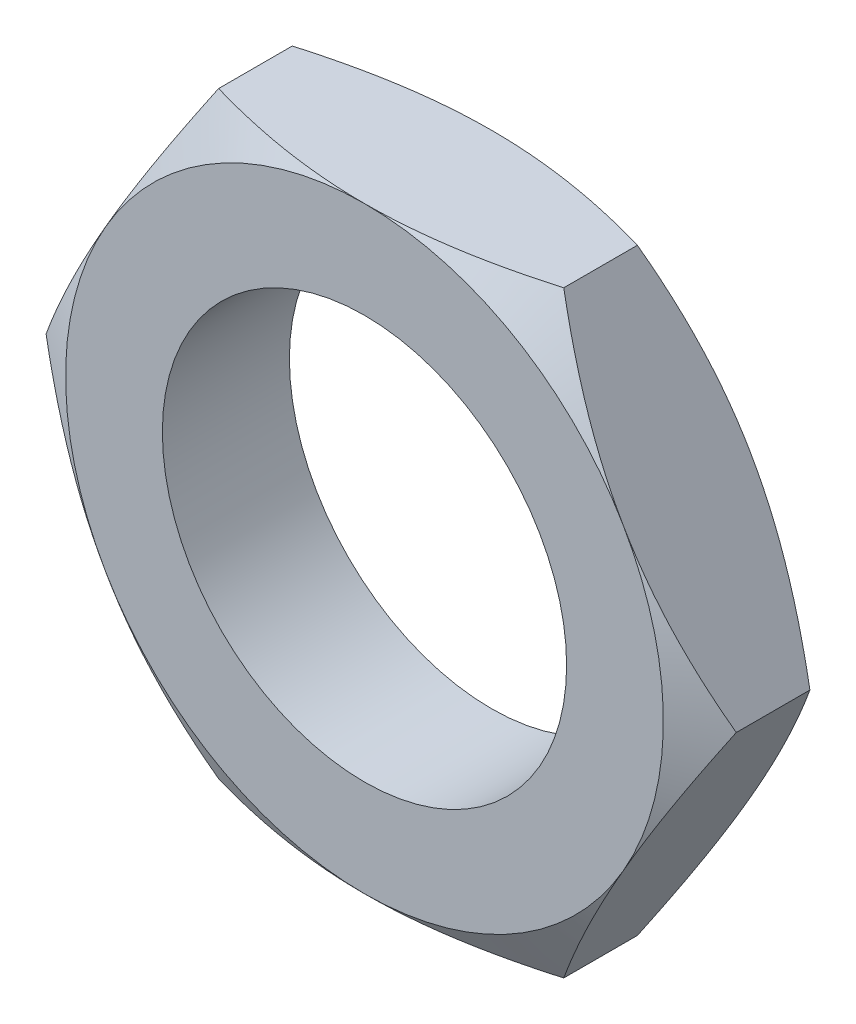
ISO-10303-21;
HEADER;
FILE_DESCRIPTION(('STEP AP214'),'2;1');
FILE_NAME('part.step','',(''),(''),'','','');
FILE_SCHEMA(('AUTOMOTIVE_DESIGN { 1 0 10303 214 1 1 1 1 }'));
ENDSEC;
DATA;
#1=APPLICATION_CONTEXT('core data for automotive mechanical design processes');
#2=APPLICATION_PROTOCOL_DEFINITION('international standard','automotive_design',2000,#1);
#3=PRODUCT_CONTEXT('',#1,'mechanical');
#4=PRODUCT('Part','Part','',(#3));
#5=PRODUCT_RELATED_PRODUCT_CATEGORY('part','',(#4));
#6=PRODUCT_DEFINITION_FORMATION('','',#4);
#7=PRODUCT_DEFINITION_CONTEXT('part definition',#1,'design');
#8=PRODUCT_DEFINITION('design','',#6,#7);
#9=PRODUCT_DEFINITION_SHAPE('','',#8);
#10=(LENGTH_UNIT() NAMED_UNIT(*) SI_UNIT(.MILLI.,.METRE.));
#11=(NAMED_UNIT(*) PLANE_ANGLE_UNIT() SI_UNIT($,.RADIAN.));
#12=(NAMED_UNIT(*) SI_UNIT($,.STERADIAN.) SOLID_ANGLE_UNIT());
#13=UNCERTAINTY_MEASURE_WITH_UNIT(LENGTH_MEASURE(1.E-05),#10,'distance_accuracy_value','');
#14=(GEOMETRIC_REPRESENTATION_CONTEXT(3) GLOBAL_UNCERTAINTY_ASSIGNED_CONTEXT((#13)) GLOBAL_UNIT_ASSIGNED_CONTEXT((#10,
#11,#12)) REPRESENTATION_CONTEXT('',''));
#15=CARTESIAN_POINT('',(0.,0.,0.));
#16=DIRECTION('',(0.,0.,1.));
#17=DIRECTION('',(1.,0.,0.));
#18=AXIS2_PLACEMENT_3D('',#15,#16,#17);
#19=CARTESIAN_POINT('',(-2.3094010767585,4.,0.85));
#20=DIRECTION('',(0.866025403784439,-0.5,0.));
#21=DIRECTION('',(0.5,0.866025403784439,0.));
#22=AXIS2_PLACEMENT_3D('',#19,#20,#21);
#23=PLANE('',#22);
#24=DIRECTION('',(0.,0.,-1.));
#25=VECTOR('',#24,1.);
#26=CARTESIAN_POINT('',(-2.3094010767585,4.,0.85));
#27=LINE('',#26,#25);
#28=CARTESIAN_POINT('',(-2.30940107675893,4.,0.492734410092085));
#29=VERTEX_POINT('',#28);
#30=CARTESIAN_POINT('',(-2.3094010767585,4.,-0.492734410091836));
#31=VERTEX_POINT('',#30);
#32=EDGE_CURVE('E264',#29,#31,#27,.T.);
#33=ORIENTED_EDGE('',*,*,#32,.T.);
#34=CARTESIAN_POINT('',(-2.30928560670467,4.0002,-0.492667740925232));
#35=CARTESIAN_POINT('',(-2.4107717464617,3.82442084967677,-0.551282126351716));
#36=CARTESIAN_POINT('',(-2.51313390883499,3.64712438367362,-0.604589678537736));
#37=CARTESIAN_POINT('',(-2.71963072479811,3.28946140682429,-0.697638329253595));
#38=CARTESIAN_POINT('',(-2.82376904741904,3.10908854102985,-0.737346510970295));
#39=CARTESIAN_POINT('',(-3.03075510011795,2.75057818129721,-0.79915778471972));
#40=CARTESIAN_POINT('',(-3.13357098372492,2.57249584706486,-0.82167226847711));
#41=CARTESIAN_POINT('',(-3.33968651028528,2.21549328283349,-0.848549376853417));
#42=CARTESIAN_POINT('',(-3.44298540411434,2.0365743503559,-0.852934258573055));
#43=CARTESIAN_POINT('',(-3.63600352522932,1.70225715780327,-0.843809927060029));
#44=CARTESIAN_POINT('',(-3.72575165335064,1.54680884001293,-0.832541046012005));
#45=CARTESIAN_POINT('',(-3.90466320392054,1.23692494436494,-0.796826009201806));
#46=CARTESIAN_POINT('',(-3.99382600759478,1.08249043825587,-0.772367654288466));
#47=CARTESIAN_POINT('',(-4.17310641015197,0.771967672225421,-0.71122393508071));
#48=CARTESIAN_POINT('',(-4.26320131938131,0.615918711936897,-0.674279396345136));
#49=CARTESIAN_POINT('',(-4.4420474282755,0.30614816459616,-0.590429927451973));
#50=CARTESIAN_POINT('',(-4.53080091904966,0.15242260922622,-0.54354469778726));
#51=CARTESIAN_POINT('',(-4.61891762357084,-0.000200000000000639,-0.492667740925233));
#52=B_SPLINE_CURVE_WITH_KNOTS('',3,(#34,#35,#36,#37,#38,#39,#40,#41,#42,#43,#44,#45,#46,#47,#48,
#49,#50,#51),.UNSPECIFIED.,.F.,.F.,(4,2,2,2,2,2,2,2,4),(0.,0.634047835695966,1.26961969224543,
1.88946157213122,2.50854226669297,3.04757825393386,3.58711366126903,4.13861653143764,
4.68903648037743),.UNSPECIFIED.);
#53=CARTESIAN_POINT('',(-3.46410161513775,2.,-0.85));
#54=VERTEX_POINT('',#53);
#55=EDGE_CURVE('E76',#31,#54,#52,.T.);
#56=ORIENTED_EDGE('',*,*,#55,.T.);
#57=CARTESIAN_POINT('',(-4.618802153517,0.,-0.492734410091837));
#58=VERTEX_POINT('',#57);
#59=EDGE_CURVE('E228',#54,#58,#52,.T.);
#60=ORIENTED_EDGE('',*,*,#59,.T.);
#61=DIRECTION('',(0.,0.,-1.));
#62=VECTOR('',#61,1.);
#63=CARTESIAN_POINT('',(-4.618802153517,0.,0.85));
#64=LINE('',#63,#62);
#65=CARTESIAN_POINT('',(-4.618802153517,0.,0.492734410091837));
#66=VERTEX_POINT('',#65);
#67=EDGE_CURVE('E276',#66,#58,#64,.T.);
#68=ORIENTED_EDGE('',*,*,#67,.F.);
#69=CARTESIAN_POINT('',(-2.30928560670467,4.0002,0.492667740925232));
#70=CARTESIAN_POINT('',(-2.4107717464617,3.82442084967677,0.551282126351716));
#71=CARTESIAN_POINT('',(-2.51313390883499,3.64712438367362,0.604589678537736));
#72=CARTESIAN_POINT('',(-2.71963072479811,3.28946140682429,0.697638329253595));
#73=CARTESIAN_POINT('',(-2.82376904741904,3.10908854102985,0.737346510970295));
#74=CARTESIAN_POINT('',(-3.03075510011795,2.75057818129721,0.79915778471972));
#75=CARTESIAN_POINT('',(-3.13357098372492,2.57249584706486,0.82167226847711));
#76=CARTESIAN_POINT('',(-3.33968651028528,2.21549328283349,0.848549376853417));
#77=CARTESIAN_POINT('',(-3.44298540411434,2.0365743503559,0.852934258573055));
#78=CARTESIAN_POINT('',(-3.63600352522932,1.70225715780327,0.843809927060029));
#79=CARTESIAN_POINT('',(-3.72575165335064,1.54680884001293,0.832541046012005));
#80=CARTESIAN_POINT('',(-3.90466320392054,1.23692494436494,0.796826009201806));
#81=CARTESIAN_POINT('',(-3.99382600759478,1.08249043825587,0.772367654288466));
#82=CARTESIAN_POINT('',(-4.17310641015197,0.771967672225421,0.71122393508071));
#83=CARTESIAN_POINT('',(-4.26320131938131,0.615918711936897,0.674279396345136));
#84=CARTESIAN_POINT('',(-4.4420474282755,0.30614816459616,0.590429927451973));
#85=CARTESIAN_POINT('',(-4.53080091904966,0.15242260922622,0.54354469778726));
#86=CARTESIAN_POINT('',(-4.61891762357084,-0.000200000000000639,0.492667740925233));
#87=B_SPLINE_CURVE_WITH_KNOTS('',3,(#69,#70,#71,#72,#73,#74,#75,#76,#77,#78,#79,#80,#81,#82,#83,
#84,#85,#86),.UNSPECIFIED.,.F.,.F.,(4,2,2,2,2,2,2,2,4),(0.,0.634047835695966,1.26961969224543,
1.88946157213122,2.50854226669297,3.04757825393386,3.58711366126903,4.13861653143764,
4.68903648037743),.UNSPECIFIED.);
#88=CARTESIAN_POINT('',(-3.46410161513775,2.,0.85));
#89=VERTEX_POINT('',#88);
#90=EDGE_CURVE('E257',#89,#66,#87,.T.);
#91=ORIENTED_EDGE('',*,*,#90,.F.);
#92=EDGE_CURVE('E263',#29,#89,#87,.T.);
#93=ORIENTED_EDGE('',*,*,#92,.F.);
#94=EDGE_LOOP('',(#33,#56,#60,#68,#91,#93));
#95=FACE_BOUND('',#94,.T.);
#96=ADVANCED_FACE('F54',(#95),#23,.F.);
#97=CARTESIAN_POINT('',(-4.618802153517,0.,0.85));
#98=DIRECTION('',(0.866025403784438,0.5,0.));
#99=DIRECTION('',(-0.5,0.866025403784439,0.));
#100=AXIS2_PLACEMENT_3D('',#97,#98,#99);
#101=PLANE('',#100);
#102=ORIENTED_EDGE('',*,*,#67,.T.);
#103=CARTESIAN_POINT('',(-4.61891762357084,0.00019999999999937,-0.492667740925233));
#104=CARTESIAN_POINT('',(-4.5174314838138,-0.175579150323229,-0.551282126351717));
#105=CARTESIAN_POINT('',(-4.41506932144051,-0.352875616326381,-0.604589678537737));
#106=CARTESIAN_POINT('',(-4.20857250547739,-0.710538593175707,-0.697638329253596));
#107=CARTESIAN_POINT('',(-4.10443418285646,-0.890911458970151,-0.737346510970295));
#108=CARTESIAN_POINT('',(-3.89744813015756,-1.24942181870279,-0.79915778471972));
#109=CARTESIAN_POINT('',(-3.79463224655059,-1.42750415293514,-0.82167226847711));
#110=CARTESIAN_POINT('',(-3.58851671999022,-1.78450671716651,-0.848549376853417));
#111=CARTESIAN_POINT('',(-3.48521782616117,-1.9634256496441,-0.852934258573056));
#112=CARTESIAN_POINT('',(-3.29219970504618,-2.29774284219673,-0.843809927060029));
#113=CARTESIAN_POINT('',(-3.20245157692486,-2.45319115998707,-0.832541046012005));
#114=CARTESIAN_POINT('',(-3.02354002635496,-2.76307505563506,-0.796826009201806));
#115=CARTESIAN_POINT('',(-2.93437722268072,-2.91750956174413,-0.772367654288466));
#116=CARTESIAN_POINT('',(-2.75509682012354,-3.22803232777458,-0.71122393508071));
#117=CARTESIAN_POINT('',(-2.66500191089419,-3.3840812880631,-0.674279396345136));
#118=CARTESIAN_POINT('',(-2.486155802,-3.69385183540384,-0.590429927451972));
#119=CARTESIAN_POINT('',(-2.39740231122584,-3.84757739077378,-0.543544697787259));
#120=CARTESIAN_POINT('',(-2.30928560670466,-4.0002,-0.492667740925232));
#121=B_SPLINE_CURVE_WITH_KNOTS('',3,(#103,#104,#105,#106,#107,#108,#109,#110,#111,#112,#113,
#114,#115,#116,#117,#118,#119,#120),.UNSPECIFIED.,.F.,.F.,(4,2,2,2,2,2,2,2,4),(0.,
0.634047835695966,1.26961969224543,1.88946157213122,2.50854226669297,3.04757825393386,
3.58711366126903,4.13861653143764,4.68903648037743),.UNSPECIFIED.);
#122=CARTESIAN_POINT('',(-3.46410161513775,-2.,-0.85));
#123=VERTEX_POINT('',#122);
#124=EDGE_CURVE('E226',#58,#123,#121,.T.);
#125=ORIENTED_EDGE('',*,*,#124,.T.);
#126=CARTESIAN_POINT('',(-2.30940107675882,-4.,-0.492734410092026));
#127=VERTEX_POINT('',#126);
#128=EDGE_CURVE('E220',#123,#127,#121,.T.);
#129=ORIENTED_EDGE('',*,*,#128,.T.);
#130=DIRECTION('',(0.,0.,-1.));
#131=VECTOR('',#130,1.);
#132=CARTESIAN_POINT('',(-2.3094010767585,-4.,0.85));
#133=LINE('',#132,#131);
#134=CARTESIAN_POINT('',(-2.30940107675882,-4.,0.492734410092026));
#135=VERTEX_POINT('',#134);
#136=EDGE_CURVE('E273',#135,#127,#133,.T.);
#137=ORIENTED_EDGE('',*,*,#136,.F.);
#138=CARTESIAN_POINT('',(-4.61891762357084,0.00019999999999937,0.492667740925233));
#139=CARTESIAN_POINT('',(-4.5174314838138,-0.175579150323229,0.551282126351717));
#140=CARTESIAN_POINT('',(-4.41506932144051,-0.352875616326381,0.604589678537737));
#141=CARTESIAN_POINT('',(-4.20857250547739,-0.710538593175707,0.697638329253596));
#142=CARTESIAN_POINT('',(-4.10443418285646,-0.890911458970151,0.737346510970295));
#143=CARTESIAN_POINT('',(-3.89744813015756,-1.24942181870279,0.79915778471972));
#144=CARTESIAN_POINT('',(-3.79463224655059,-1.42750415293514,0.82167226847711));
#145=CARTESIAN_POINT('',(-3.58851671999022,-1.78450671716651,0.848549376853417));
#146=CARTESIAN_POINT('',(-3.48521782616117,-1.9634256496441,0.852934258573056));
#147=CARTESIAN_POINT('',(-3.29219970504618,-2.29774284219673,0.843809927060029));
#148=CARTESIAN_POINT('',(-3.20245157692486,-2.45319115998707,0.832541046012005));
#149=CARTESIAN_POINT('',(-3.02354002635496,-2.76307505563506,0.796826009201806));
#150=CARTESIAN_POINT('',(-2.93437722268072,-2.91750956174413,0.772367654288466));
#151=CARTESIAN_POINT('',(-2.75509682012354,-3.22803232777458,0.71122393508071));
#152=CARTESIAN_POINT('',(-2.66500191089419,-3.3840812880631,0.674279396345136));
#153=CARTESIAN_POINT('',(-2.486155802,-3.69385183540384,0.590429927451972));
#154=CARTESIAN_POINT('',(-2.39740231122584,-3.84757739077378,0.543544697787259));
#155=CARTESIAN_POINT('',(-2.30928560670466,-4.0002,0.492667740925232));
#156=B_SPLINE_CURVE_WITH_KNOTS('',3,(#138,#139,#140,#141,#142,#143,#144,#145,#146,#147,#148,
#149,#150,#151,#152,#153,#154,#155),.UNSPECIFIED.,.F.,.F.,(4,2,2,2,2,2,2,2,4),(0.,
0.634047835695966,1.26961969224543,1.88946157213122,2.50854226669297,3.04757825393386,
3.58711366126903,4.13861653143764,4.68903648037743),.UNSPECIFIED.);
#157=CARTESIAN_POINT('',(-3.46410161513775,-2.,0.85));
#158=VERTEX_POINT('',#157);
#159=EDGE_CURVE('E242',#158,#135,#156,.T.);
#160=ORIENTED_EDGE('',*,*,#159,.F.);
#161=EDGE_CURVE('E249',#66,#158,#156,.T.);
#162=ORIENTED_EDGE('',*,*,#161,.F.);
#163=EDGE_LOOP('',(#102,#125,#129,#137,#160,#162));
#164=FACE_BOUND('',#163,.T.);
#165=ADVANCED_FACE('F234',(#164),#101,.F.);
#166=CARTESIAN_POINT('',(-2.3094010767585,-4.,0.85));
#167=DIRECTION('',(0.,1.,0.));
#168=DIRECTION('',(-1.,0.,0.));
#169=AXIS2_PLACEMENT_3D('',#166,#167,#168);
#170=PLANE('',#169);
#171=ORIENTED_EDGE('',*,*,#136,.T.);
#172=CARTESIAN_POINT('',(-7.0354167030111,-4.,1.51311031737804));
#173=CARTESIAN_POINT('',(-6.86760372971957,-4.,1.42889772977423));
#174=CARTESIAN_POINT('',(-6.69950328318655,-4.,1.34525210262091));
#175=CARTESIAN_POINT('',(-6.36259576329523,-4.,1.1793695055301));
#176=CARTESIAN_POINT('',(-6.19378864497809,-4.,1.09713262696631));
#177=CARTESIAN_POINT('',(-5.85502434693904,-4.,0.934192854390302));
#178=CARTESIAN_POINT('',(-5.68506555655915,-4.,0.853493302095932));
#179=CARTESIAN_POINT('',(-5.34417657551742,-4.,0.694177324649562));
#180=CARTESIAN_POINT('',(-5.17324640351946,-4.,0.615560859636856));
#181=CARTESIAN_POINT('',(-4.82235493385197,-4.,0.457344528023954));
#182=CARTESIAN_POINT('',(-4.64233915836721,-4.,0.377865090957746));
#183=CARTESIAN_POINT('',(-4.28078904780677,-4.,0.222441970435232));
#184=CARTESIAN_POINT('',(-4.09925476448125,-4.,0.14649816706035));
#185=CARTESIAN_POINT('',(-3.73446517433517,-4.,-0.000854789086803862));
#186=CARTESIAN_POINT('',(-3.55121091338518,-4.,-0.072266515558576));
#187=CARTESIAN_POINT('',(-3.18256813565656,-4.,-0.209323801432343));
#188=CARTESIAN_POINT('',(-2.99717985279721,-4.,-0.274969986139144));
#189=CARTESIAN_POINT('',(-2.58163745287054,-4.,-0.412906272232169));
#190=CARTESIAN_POINT('',(-2.35085554020753,-4.,-0.483332935105294));
#191=CARTESIAN_POINT('',(-1.88511085576049,-4.,-0.609144464884783));
#192=CARTESIAN_POINT('',(-1.6501483787916,-4.,-0.664530388025829));
#193=CARTESIAN_POINT('',(-1.29690070623206,-4.,-0.732475974569591));
#194=CARTESIAN_POINT('',(-1.18003772774412,-4.,-0.752491766949099));
#195=CARTESIAN_POINT('',(-0.945537516329266,-4.,-0.787256431534388));
#196=CARTESIAN_POINT('',(-0.827900398276434,-4.,-0.80200606800022));
#197=CARTESIAN_POINT('',(-0.592082435668501,-4.,-0.825799345702007));
#198=CARTESIAN_POINT('',(-0.473901769485933,-4.,-0.834844740629782));
#199=CARTESIAN_POINT('',(-0.237231351511309,-4.,-0.846942916621338));
#200=CARTESIAN_POINT('',(-0.118741601367087,-4.,-0.849995729568525));
#201=CARTESIAN_POINT('',(0.119039549355623,-4.,-0.850004290137372));
#202=CARTESIAN_POINT('',(0.238330953445572,-4.,-0.846918674819495));
#203=CARTESIAN_POINT('',(0.476598553826428,-4.,-0.834674397064765));
#204=CARTESIAN_POINT('',(0.595574748727477,-4.,-0.825515707894364));
#205=CARTESIAN_POINT('',(0.832974734060533,-4.,-0.801422792664298));
#206=CARTESIAN_POINT('',(0.951398334766151,-4.,-0.786486712269391));
#207=CARTESIAN_POINT('',(1.18745780226662,-4.,-0.751286766300194));
#208=CARTESIAN_POINT('',(1.30509355039818,-4.,-0.731022115874979));
#209=CARTESIAN_POINT('',(1.66061817953805,-4.,-0.662253816619181));
#210=CARTESIAN_POINT('',(1.89706203836294,-4.,-0.606218871176658));
#211=CARTESIAN_POINT('',(2.3658378938922,-4.,-0.478963895761078));
#212=CARTESIAN_POINT('',(2.59816739318186,-4.,-0.407734963596663));
#213=CARTESIAN_POINT('',(3.01441850757065,-4.,-0.268970558638927));
#214=CARTESIAN_POINT('',(3.19900196405254,-4.,-0.203390906077278));
#215=CARTESIAN_POINT('',(3.56599056687101,-4.,-0.0665787444425987));
#216=CARTESIAN_POINT('',(3.7483963070025,-4.,0.00465218124216086));
#217=CARTESIAN_POINT('',(4.11154199823315,-4.,0.151590843250665));
#218=CARTESIAN_POINT('',(4.29228061672961,-4.,0.227301853483712));
#219=CARTESIAN_POINT('',(4.65225738549896,-4.,0.382213731889331));
#220=CARTESIAN_POINT('',(4.83149548590287,-4.,0.461414715505863));
#221=CARTESIAN_POINT('',(5.18089735939133,-4.,0.619062057539629));
#222=CARTESIAN_POINT('',(5.35111488257247,-4.,0.697389668173014));
#223=CARTESIAN_POINT('',(5.69058260216348,-4.,0.856103128401234));
#224=CARTESIAN_POINT('',(5.85983281371757,-4.,0.936488945664216));
#225=CARTESIAN_POINT('',(6.19719884389014,-4.,1.09878998799408));
#226=CARTESIAN_POINT('',(6.36531621133107,-4.,1.18070200024097));
#227=CARTESIAN_POINT('',(6.7008563504105,-4.,1.34592527628057));
#228=CARTESIAN_POINT('',(6.86827914209004,-4.,1.42923649934582));
#229=CARTESIAN_POINT('',(7.03541670301111,-4.,1.51311031737804));
#230=B_SPLINE_CURVE_WITH_KNOTS('',3,(#172,#173,#174,#175,#176,#177,#178,#179,#180,#181,#182,
#183,#184,#185,#186,#187,#188,#189,#190,#191,#192,#193,#194,#195,#196,#197,#198,#199,#200,#201,
#202,#203,#204,#205,#206,#207,#208,#209,#210,#211,#212,#213,#214,#215,#216,#217,#218,#219,#220,
#221,#222,#223,#224,#225,#226,#227,#228,#229),.UNSPECIFIED.,.F.,.F.,(4,2,2,2,2,2,2,2,2,2,2,2,2,
2,2,2,2,2,2,2,2,2,2,2,2,2,2,2,4),(0.,0.563275966024877,1.12658832975423,1.69101060535138,
2.25542207269203,2.84573438591308,3.43602666282177,4.02598066519246,4.61587060458144,
5.33938309647816,6.06284476662439,6.41843896725476,6.77398154066042,7.12941475395937,
7.48484607617825,7.84268053519258,8.20051656939736,8.5584675515567,8.91647128627039,
9.64469684526638,10.3733502509875,10.9609014277994,11.5482885604647,12.1361103697513,
12.723951638067,13.2860589593527,13.8481574560461,14.409182835701,14.9701919135405),.UNSPECIFIED.);
#231=CARTESIAN_POINT('',(0.,-4.,-0.85));
#232=VERTEX_POINT('',#231);
#233=EDGE_CURVE('E227',#127,#232,#230,.T.);
#234=ORIENTED_EDGE('',*,*,#233,.T.);
#235=CARTESIAN_POINT('',(2.3094010767585,-4.,-0.492734410091836));
#236=VERTEX_POINT('',#235);
#237=EDGE_CURVE('E213',#232,#236,#230,.T.);
#238=ORIENTED_EDGE('',*,*,#237,.T.);
#239=DIRECTION('',(0.,0.,-1.));
#240=VECTOR('',#239,1.);
#241=CARTESIAN_POINT('',(2.3094010767585,-4.,0.85));
#242=LINE('',#241,#240);
#243=CARTESIAN_POINT('',(2.3094010767585,-4.,0.492734410091836));
#244=VERTEX_POINT('',#243);
#245=EDGE_CURVE('E270',#244,#236,#242,.T.);
#246=ORIENTED_EDGE('',*,*,#245,.F.);
#247=CARTESIAN_POINT('',(-7.0354167030111,-4.,-1.51311031737804));
#248=CARTESIAN_POINT('',(-6.86760372971957,-4.,-1.42889772977423));
#249=CARTESIAN_POINT('',(-6.69950328318655,-4.,-1.34525210262091));
#250=CARTESIAN_POINT('',(-6.36259576329523,-4.,-1.1793695055301));
#251=CARTESIAN_POINT('',(-6.19378864497809,-4.,-1.09713262696631));
#252=CARTESIAN_POINT('',(-5.85502434693904,-4.,-0.934192854390302));
#253=CARTESIAN_POINT('',(-5.68506555655915,-4.,-0.853493302095932));
#254=CARTESIAN_POINT('',(-5.34417657551742,-4.,-0.694177324649562));
#255=CARTESIAN_POINT('',(-5.17324640351946,-4.,-0.615560859636856));
#256=CARTESIAN_POINT('',(-4.82235493385197,-4.,-0.457344528023954));
#257=CARTESIAN_POINT('',(-4.64233915836721,-4.,-0.377865090957746));
#258=CARTESIAN_POINT('',(-4.28078904780677,-4.,-0.222441970435232));
#259=CARTESIAN_POINT('',(-4.09925476448125,-4.,-0.14649816706035));
#260=CARTESIAN_POINT('',(-3.73446517433517,-4.,0.000854789086803862));
#261=CARTESIAN_POINT('',(-3.55121091338518,-4.,0.072266515558576));
#262=CARTESIAN_POINT('',(-3.18256813565656,-4.,0.209323801432343));
#263=CARTESIAN_POINT('',(-2.99717985279721,-4.,0.274969986139144));
#264=CARTESIAN_POINT('',(-2.58163745287054,-4.,0.412906272232169));
#265=CARTESIAN_POINT('',(-2.35085554020753,-4.,0.483332935105294));
#266=CARTESIAN_POINT('',(-1.88511085576049,-4.,0.609144464884783));
#267=CARTESIAN_POINT('',(-1.6501483787916,-4.,0.664530388025829));
#268=CARTESIAN_POINT('',(-1.29690070623206,-4.,0.732475974569591));
#269=CARTESIAN_POINT('',(-1.18003772774412,-4.,0.752491766949099));
#270=CARTESIAN_POINT('',(-0.945537516329266,-4.,0.787256431534388));
#271=CARTESIAN_POINT('',(-0.827900398276434,-4.,0.80200606800022));
#272=CARTESIAN_POINT('',(-0.592082435668501,-4.,0.825799345702007));
#273=CARTESIAN_POINT('',(-0.473901769485933,-4.,0.834844740629782));
#274=CARTESIAN_POINT('',(-0.237231351511309,-4.,0.846942916621338));
#275=CARTESIAN_POINT('',(-0.118741601367087,-4.,0.849995729568525));
#276=CARTESIAN_POINT('',(0.119039549355623,-4.,0.850004290137372));
#277=CARTESIAN_POINT('',(0.238330953445572,-4.,0.846918674819495));
#278=CARTESIAN_POINT('',(0.476598553826428,-4.,0.834674397064765));
#279=CARTESIAN_POINT('',(0.595574748727477,-4.,0.825515707894364));
#280=CARTESIAN_POINT('',(0.832974734060533,-4.,0.801422792664298));
#281=CARTESIAN_POINT('',(0.951398334766151,-4.,0.786486712269391));
#282=CARTESIAN_POINT('',(1.18745780226662,-4.,0.751286766300194));
#283=CARTESIAN_POINT('',(1.30509355039818,-4.,0.731022115874979));
#284=CARTESIAN_POINT('',(1.66061817953805,-4.,0.662253816619181));
#285=CARTESIAN_POINT('',(1.89706203836294,-4.,0.606218871176658));
#286=CARTESIAN_POINT('',(2.3658378938922,-4.,0.478963895761078));
#287=CARTESIAN_POINT('',(2.59816739318186,-4.,0.407734963596663));
#288=CARTESIAN_POINT('',(3.01441850757065,-4.,0.268970558638927));
#289=CARTESIAN_POINT('',(3.19900196405254,-4.,0.203390906077278));
#290=CARTESIAN_POINT('',(3.56599056687101,-4.,0.0665787444425987));
#291=CARTESIAN_POINT('',(3.7483963070025,-4.,-0.00465218124216086));
#292=CARTESIAN_POINT('',(4.11154199823315,-4.,-0.151590843250665));
#293=CARTESIAN_POINT('',(4.29228061672961,-4.,-0.227301853483712));
#294=CARTESIAN_POINT('',(4.65225738549896,-4.,-0.382213731889331));
#295=CARTESIAN_POINT('',(4.83149548590287,-4.,-0.461414715505863));
#296=CARTESIAN_POINT('',(5.18089735939133,-4.,-0.619062057539629));
#297=CARTESIAN_POINT('',(5.35111488257247,-4.,-0.697389668173014));
#298=CARTESIAN_POINT('',(5.69058260216348,-4.,-0.856103128401234));
#299=CARTESIAN_POINT('',(5.85983281371757,-4.,-0.936488945664216));
#300=CARTESIAN_POINT('',(6.19719884389014,-4.,-1.09878998799408));
#301=CARTESIAN_POINT('',(6.36531621133107,-4.,-1.18070200024097));
#302=CARTESIAN_POINT('',(6.7008563504105,-4.,-1.34592527628057));
#303=CARTESIAN_POINT('',(6.86827914209004,-4.,-1.42923649934582));
#304=CARTESIAN_POINT('',(7.03541670301111,-4.,-1.51311031737804));
#305=B_SPLINE_CURVE_WITH_KNOTS('',3,(#247,#248,#249,#250,#251,#252,#253,#254,#255,#256,#257,
#258,#259,#260,#261,#262,#263,#264,#265,#266,#267,#268,#269,#270,#271,#272,#273,#274,#275,#276,
#277,#278,#279,#280,#281,#282,#283,#284,#285,#286,#287,#288,#289,#290,#291,#292,#293,#294,#295,
#296,#297,#298,#299,#300,#301,#302,#303,#304),.UNSPECIFIED.,.F.,.F.,(4,2,2,2,2,2,2,2,2,2,2,2,2,
2,2,2,2,2,2,2,2,2,2,2,2,2,2,2,4),(0.,0.563275966024877,1.12658832975423,1.69101060535138,
2.25542207269203,2.84573438591308,3.43602666282177,4.02598066519246,4.61587060458144,
5.33938309647816,6.06284476662439,6.41843896725476,6.77398154066042,7.12941475395937,
7.48484607617825,7.84268053519258,8.20051656939736,8.5584675515567,8.91647128627039,
9.64469684526638,10.3733502509875,10.9609014277994,11.5482885604647,12.1361103697513,
12.723951638067,13.2860589593527,13.8481574560461,14.409182835701,14.9701919135405),.UNSPECIFIED.);
#306=CARTESIAN_POINT('',(0.,-4.,0.85));
#307=VERTEX_POINT('',#306);
#308=EDGE_CURVE('E251',#307,#244,#305,.T.);
#309=ORIENTED_EDGE('',*,*,#308,.F.);
#310=EDGE_CURVE('E250',#135,#307,#305,.T.);
#311=ORIENTED_EDGE('',*,*,#310,.F.);
#312=EDGE_LOOP('',(#171,#234,#238,#246,#309,#311));
#313=FACE_BOUND('',#312,.T.);
#314=ADVANCED_FACE('F237',(#313),#170,.F.);
#315=CARTESIAN_POINT('',(2.3094010767585,-4.,0.85));
#316=DIRECTION('',(-0.866025403784439,0.5,0.));
#317=DIRECTION('',(-0.5,-0.866025403784439,0.));
#318=AXIS2_PLACEMENT_3D('',#315,#316,#317);
#319=PLANE('',#318);
#320=ORIENTED_EDGE('',*,*,#245,.T.);
#321=CARTESIAN_POINT('',(2.30928560670467,-4.0002,-0.492667740925231));
#322=CARTESIAN_POINT('',(2.41077174646171,-3.82442084967677,-0.551282126351716));
#323=CARTESIAN_POINT('',(2.513133908835,-3.64712438367362,-0.604589678537735));
#324=CARTESIAN_POINT('',(2.71963072479812,-3.28946140682429,-0.697638329253595));
#325=CARTESIAN_POINT('',(2.82376904741904,-3.10908854102985,-0.737346510970294));
#326=CARTESIAN_POINT('',(3.03075510011795,-2.75057818129721,-0.799157784719719));
#327=CARTESIAN_POINT('',(3.13357098372492,-2.57249584706486,-0.821672268477109));
#328=CARTESIAN_POINT('',(3.33968651028528,-2.21549328283349,-0.848549376853416));
#329=CARTESIAN_POINT('',(3.44298540411434,-2.0365743503559,-0.852934258573055));
#330=CARTESIAN_POINT('',(3.63600352522932,-1.70225715780327,-0.843809927060028));
#331=CARTESIAN_POINT('',(3.72575165335065,-1.54680884001293,-0.832541046012004));
#332=CARTESIAN_POINT('',(3.90466320392054,-1.23692494436494,-0.796826009201805));
#333=CARTESIAN_POINT('',(3.99382600759478,-1.08249043825587,-0.772367654288465));
#334=CARTESIAN_POINT('',(4.17310641015197,-0.771967672225421,-0.711223935080709));
#335=CARTESIAN_POINT('',(4.26320131938131,-0.615918711936896,-0.674279396345135));
#336=CARTESIAN_POINT('',(4.4420474282755,-0.306148164596159,-0.590429927451971));
#337=CARTESIAN_POINT('',(4.53080091904966,-0.152422609226219,-0.543544697787258));
#338=CARTESIAN_POINT('',(4.61891762357084,0.000200000000001888,-0.492667740925232));
#339=B_SPLINE_CURVE_WITH_KNOTS('',3,(#321,#322,#323,#324,#325,#326,#327,#328,#329,#330,#331,
#332,#333,#334,#335,#336,#337,#338),.UNSPECIFIED.,.F.,.F.,(4,2,2,2,2,2,2,2,4),(0.,
0.634047835695966,1.26961969224543,1.88946157213122,2.50854226669297,3.04757825393386,
3.58711366126903,4.13861653143764,4.68903648037743),.UNSPECIFIED.);
#340=CARTESIAN_POINT('',(3.46410161513775,-2.,-0.85));
#341=VERTEX_POINT('',#340);
#342=EDGE_CURVE('E176',#236,#341,#339,.T.);
#343=ORIENTED_EDGE('',*,*,#342,.T.);
#344=CARTESIAN_POINT('',(4.61880215351701,0.,-0.492734410091836));
#345=VERTEX_POINT('',#344);
#346=EDGE_CURVE('E161',#341,#345,#339,.T.);
#347=ORIENTED_EDGE('',*,*,#346,.T.);
#348=DIRECTION('',(0.,0.,-1.));
#349=VECTOR('',#348,1.);
#350=CARTESIAN_POINT('',(4.61880215351701,0.,0.85));
#351=LINE('',#350,#349);
#352=CARTESIAN_POINT('',(4.61880215351701,0.,0.492734410091836));
#353=VERTEX_POINT('',#352);
#354=EDGE_CURVE('E175',#353,#345,#351,.T.);
#355=ORIENTED_EDGE('',*,*,#354,.F.);
#356=CARTESIAN_POINT('',(2.30928560670467,-4.0002,0.492667740925231));
#357=CARTESIAN_POINT('',(2.41077174646171,-3.82442084967677,0.551282126351716));
#358=CARTESIAN_POINT('',(2.513133908835,-3.64712438367362,0.604589678537735));
#359=CARTESIAN_POINT('',(2.71963072479812,-3.28946140682429,0.697638329253595));
#360=CARTESIAN_POINT('',(2.82376904741904,-3.10908854102985,0.737346510970294));
#361=CARTESIAN_POINT('',(3.03075510011795,-2.75057818129721,0.799157784719719));
#362=CARTESIAN_POINT('',(3.13357098372492,-2.57249584706486,0.821672268477109));
#363=CARTESIAN_POINT('',(3.33968651028528,-2.21549328283349,0.848549376853416));
#364=CARTESIAN_POINT('',(3.44298540411434,-2.0365743503559,0.852934258573055));
#365=CARTESIAN_POINT('',(3.63600352522932,-1.70225715780327,0.843809927060028));
#366=CARTESIAN_POINT('',(3.72575165335065,-1.54680884001293,0.832541046012004));
#367=CARTESIAN_POINT('',(3.90466320392054,-1.23692494436494,0.796826009201805));
#368=CARTESIAN_POINT('',(3.99382600759478,-1.08249043825587,0.772367654288465));
#369=CARTESIAN_POINT('',(4.17310641015197,-0.771967672225421,0.711223935080709));
#370=CARTESIAN_POINT('',(4.26320131938131,-0.615918711936896,0.674279396345135));
#371=CARTESIAN_POINT('',(4.4420474282755,-0.306148164596159,0.590429927451971));
#372=CARTESIAN_POINT('',(4.53080091904966,-0.152422609226219,0.543544697787258));
#373=CARTESIAN_POINT('',(4.61891762357084,0.000200000000001888,0.492667740925232));
#374=B_SPLINE_CURVE_WITH_KNOTS('',3,(#356,#357,#358,#359,#360,#361,#362,#363,#364,#365,#366,
#367,#368,#369,#370,#371,#372,#373),.UNSPECIFIED.,.F.,.F.,(4,2,2,2,2,2,2,2,4),(0.,
0.634047835695966,1.26961969224543,1.88946157213122,2.50854226669297,3.04757825393386,
3.58711366126903,4.13861653143764,4.68903648037743),.UNSPECIFIED.);
#375=CARTESIAN_POINT('',(3.46410161513775,-2.,0.85));
#376=VERTEX_POINT('',#375);
#377=EDGE_CURVE('E308',#376,#353,#374,.T.);
#378=ORIENTED_EDGE('',*,*,#377,.F.);
#379=EDGE_CURVE('E307',#244,#376,#374,.T.);
#380=ORIENTED_EDGE('',*,*,#379,.F.);
#381=EDGE_LOOP('',(#320,#343,#347,#355,#378,#380));
#382=FACE_BOUND('',#381,.T.);
#383=ADVANCED_FACE('F321',(#382),#319,.F.);
#384=CARTESIAN_POINT('',(4.61880215351701,0.,0.85));
#385=DIRECTION('',(-0.866025403784438,-0.5,0.));
#386=DIRECTION('',(0.5,-0.866025403784438,0.));
#387=AXIS2_PLACEMENT_3D('',#384,#385,#386);
#388=PLANE('',#387);
#389=ORIENTED_EDGE('',*,*,#354,.T.);
#390=CARTESIAN_POINT('',(4.61891762357084,-0.000199999999998687,-0.492667740925231));
#391=CARTESIAN_POINT('',(4.5174314838138,0.175579150323229,-0.551282126351716));
#392=CARTESIAN_POINT('',(4.41506932144052,0.352875616326382,-0.604589678537735));
#393=CARTESIAN_POINT('',(4.20857250547739,0.710538593175708,-0.697638329253594));
#394=CARTESIAN_POINT('',(4.10443418285647,0.890911458970152,-0.737346510970294));
#395=CARTESIAN_POINT('',(3.89744813015756,1.24942181870279,-0.799157784719719));
#396=CARTESIAN_POINT('',(3.79463224655059,1.42750415293514,-0.821672268477109));
#397=CARTESIAN_POINT('',(3.58851671999023,1.78450671716651,-0.848549376853416));
#398=CARTESIAN_POINT('',(3.48521782616117,1.9634256496441,-0.852934258573054));
#399=CARTESIAN_POINT('',(3.29219970504619,2.29774284219673,-0.843809927060028));
#400=CARTESIAN_POINT('',(3.20245157692486,2.45319115998707,-0.832541046012004));
#401=CARTESIAN_POINT('',(3.02354002635497,2.76307505563506,-0.796826009201805));
#402=CARTESIAN_POINT('',(2.93437722268072,2.91750956174413,-0.772367654288465));
#403=CARTESIAN_POINT('',(2.75509682012354,3.22803232777458,-0.711223935080709));
#404=CARTESIAN_POINT('',(2.6650019108942,3.3840812880631,-0.674279396345135));
#405=CARTESIAN_POINT('',(2.48615580200001,3.69385183540384,-0.590429927451971));
#406=CARTESIAN_POINT('',(2.39740231122585,3.84757739077378,-0.543544697787258));
#407=CARTESIAN_POINT('',(2.30928560670466,4.0002,-0.492667740925232));
#408=B_SPLINE_CURVE_WITH_KNOTS('',3,(#390,#391,#392,#393,#394,#395,#396,#397,#398,#399,#400,
#401,#402,#403,#404,#405,#406,#407),.UNSPECIFIED.,.F.,.F.,(4,2,2,2,2,2,2,2,4),(0.,
0.634047835695966,1.26961969224543,1.88946157213122,2.50854226669297,3.04757825393386,
3.58711366126903,4.13861653143764,4.68903648037743),.UNSPECIFIED.);
#409=CARTESIAN_POINT('',(3.46410161513775,2.,-0.85));
#410=VERTEX_POINT('',#409);
#411=EDGE_CURVE('E155',#345,#410,#408,.T.);
#412=ORIENTED_EDGE('',*,*,#411,.T.);
#413=CARTESIAN_POINT('',(2.30940107675883,4.,-0.492734410092026));
#414=VERTEX_POINT('',#413);
#415=EDGE_CURVE('E143',#410,#414,#408,.T.);
#416=ORIENTED_EDGE('',*,*,#415,.T.);
#417=DIRECTION('',(0.,0.,-1.));
#418=VECTOR('',#417,1.);
#419=CARTESIAN_POINT('',(2.3094010767585,4.,0.85));
#420=LINE('',#419,#418);
#421=CARTESIAN_POINT('',(2.30940107675883,4.,0.492734410092026));
#422=VERTEX_POINT('',#421);
#423=EDGE_CURVE('E267',#422,#414,#420,.T.);
#424=ORIENTED_EDGE('',*,*,#423,.F.);
#425=CARTESIAN_POINT('',(4.61891762357084,-0.000199999999998687,0.492667740925231));
#426=CARTESIAN_POINT('',(4.5174314838138,0.175579150323229,0.551282126351716));
#427=CARTESIAN_POINT('',(4.41506932144052,0.352875616326382,0.604589678537735));
#428=CARTESIAN_POINT('',(4.20857250547739,0.710538593175708,0.697638329253594));
#429=CARTESIAN_POINT('',(4.10443418285647,0.890911458970152,0.737346510970294));
#430=CARTESIAN_POINT('',(3.89744813015756,1.24942181870279,0.799157784719719));
#431=CARTESIAN_POINT('',(3.79463224655059,1.42750415293514,0.821672268477109));
#432=CARTESIAN_POINT('',(3.58851671999023,1.78450671716651,0.848549376853416));
#433=CARTESIAN_POINT('',(3.48521782616117,1.9634256496441,0.852934258573054));
#434=CARTESIAN_POINT('',(3.29219970504619,2.29774284219673,0.843809927060028));
#435=CARTESIAN_POINT('',(3.20245157692486,2.45319115998707,0.832541046012004));
#436=CARTESIAN_POINT('',(3.02354002635497,2.76307505563506,0.796826009201805));
#437=CARTESIAN_POINT('',(2.93437722268072,2.91750956174413,0.772367654288465));
#438=CARTESIAN_POINT('',(2.75509682012354,3.22803232777458,0.711223935080709));
#439=CARTESIAN_POINT('',(2.6650019108942,3.3840812880631,0.674279396345135));
#440=CARTESIAN_POINT('',(2.48615580200001,3.69385183540384,0.590429927451971));
#441=CARTESIAN_POINT('',(2.39740231122585,3.84757739077378,0.543544697787258));
#442=CARTESIAN_POINT('',(2.30928560670466,4.0002,0.492667740925232));
#443=B_SPLINE_CURVE_WITH_KNOTS('',3,(#425,#426,#427,#428,#429,#430,#431,#432,#433,#434,#435,
#436,#437,#438,#439,#440,#441,#442),.UNSPECIFIED.,.F.,.F.,(4,2,2,2,2,2,2,2,4),(0.,
0.634047835695966,1.26961969224543,1.88946157213122,2.50854226669297,3.04757825393386,
3.58711366126903,4.13861653143764,4.68903648037743),.UNSPECIFIED.);
#444=CARTESIAN_POINT('',(3.46410161513775,2.,0.85));
#445=VERTEX_POINT('',#444);
#446=EDGE_CURVE('E315',#445,#422,#443,.T.);
#447=ORIENTED_EDGE('',*,*,#446,.F.);
#448=EDGE_CURVE('E309',#353,#445,#443,.T.);
#449=ORIENTED_EDGE('',*,*,#448,.F.);
#450=EDGE_LOOP('',(#389,#412,#416,#424,#447,#449));
#451=FACE_BOUND('',#450,.T.);
#452=ADVANCED_FACE('F172',(#451),#388,.F.);
#453=CARTESIAN_POINT('',(2.3094010767585,4.,0.85));
#454=DIRECTION('',(0.,-1.,0.));
#455=DIRECTION('',(1.,0.,0.));
#456=AXIS2_PLACEMENT_3D('',#453,#454,#455);
#457=PLANE('',#456);
#458=ORIENTED_EDGE('',*,*,#423,.T.);
#459=CARTESIAN_POINT('',(7.03541670301111,4.,1.51311031737804));
#460=CARTESIAN_POINT('',(6.86760372971957,4.,1.42889772977423));
#461=CARTESIAN_POINT('',(6.69950328318655,4.,1.34525210262091));
#462=CARTESIAN_POINT('',(6.36259576329523,4.,1.1793695055301));
#463=CARTESIAN_POINT('',(6.19378864497809,4.,1.09713262696631));
#464=CARTESIAN_POINT('',(5.85502434693904,4.,0.934192854390303));
#465=CARTESIAN_POINT('',(5.68506555655916,4.,0.853493302095933));
#466=CARTESIAN_POINT('',(5.34417657551742,4.,0.694177324649562));
#467=CARTESIAN_POINT('',(5.17324640351946,4.,0.615560859636857));
#468=CARTESIAN_POINT('',(4.82235493385197,4.,0.457344528023955));
#469=CARTESIAN_POINT('',(4.64233915836721,4.,0.377865090957746));
#470=CARTESIAN_POINT('',(4.28078904780677,4.,0.222441970435232));
#471=CARTESIAN_POINT('',(4.09925476448125,4.,0.146498167060351));
#472=CARTESIAN_POINT('',(3.73446517433518,4.,-0.000854789086803713));
#473=CARTESIAN_POINT('',(3.55121091338518,4.,-0.0722665155585761));
#474=CARTESIAN_POINT('',(3.18256813565656,4.,-0.209323801432343));
#475=CARTESIAN_POINT('',(2.99717985279722,4.,-0.274969986139145));
#476=CARTESIAN_POINT('',(2.58163745287054,4.,-0.412906272232169));
#477=CARTESIAN_POINT('',(2.35085554020753,4.,-0.483332935105294));
#478=CARTESIAN_POINT('',(1.88511085576049,4.,-0.609144464884783));
#479=CARTESIAN_POINT('',(1.6501483787916,4.,-0.66453038802583));
#480=CARTESIAN_POINT('',(1.29690070623207,4.,-0.732475974569592));
#481=CARTESIAN_POINT('',(1.18003772774413,4.,-0.7524917669491));
#482=CARTESIAN_POINT('',(0.945537516329269,4.,-0.787256431534389));
#483=CARTESIAN_POINT('',(0.827900398276438,4.,-0.802006068000221));
#484=CARTESIAN_POINT('',(0.592082435668504,4.,-0.825799345702007));
#485=CARTESIAN_POINT('',(0.473901769485937,4.,-0.834844740629783));
#486=CARTESIAN_POINT('',(0.237231351511312,4.,-0.846942916621338));
#487=CARTESIAN_POINT('',(0.118741601367089,4.,-0.849995729568526));
#488=CARTESIAN_POINT('',(-0.119039549355621,4.,-0.850004290137373));
#489=CARTESIAN_POINT('',(-0.23833095344557,4.,-0.846918674819496));
#490=CARTESIAN_POINT('',(-0.476598553826426,4.,-0.834674397064766));
#491=CARTESIAN_POINT('',(-0.595574748727475,4.,-0.825515707894365));
#492=CARTESIAN_POINT('',(-0.832974734060531,4.,-0.801422792664298));
#493=CARTESIAN_POINT('',(-0.951398334766149,4.,-0.786486712269392));
#494=CARTESIAN_POINT('',(-1.18745780226662,4.,-0.751286766300195));
#495=CARTESIAN_POINT('',(-1.30509355039818,4.,-0.731022115874981));
#496=CARTESIAN_POINT('',(-1.66061817953805,4.,-0.662253816619182));
#497=CARTESIAN_POINT('',(-1.89706203836294,4.,-0.606218871176658));
#498=CARTESIAN_POINT('',(-2.3658378938922,4.,-0.478963895761079));
#499=CARTESIAN_POINT('',(-2.59816739318186,4.,-0.407734963596664));
#500=CARTESIAN_POINT('',(-3.01441850757064,4.,-0.268970558638928));
#501=CARTESIAN_POINT('',(-3.19900196405254,4.,-0.203390906077278));
#502=CARTESIAN_POINT('',(-3.565990566871,4.,-0.0665787444425995));
#503=CARTESIAN_POINT('',(-3.7483963070025,4.,0.00465218124215974));
#504=CARTESIAN_POINT('',(-4.11154199823315,4.,0.151590843250663));
#505=CARTESIAN_POINT('',(-4.29228061672961,4.,0.227301853483711));
#506=CARTESIAN_POINT('',(-4.65225738549896,4.,0.38221373188933));
#507=CARTESIAN_POINT('',(-4.83149548590287,4.,0.461414715505862));
#508=CARTESIAN_POINT('',(-5.18089735939133,4.,0.619062057539628));
#509=CARTESIAN_POINT('',(-5.35111488257247,4.,0.697389668173013));
#510=CARTESIAN_POINT('',(-5.69058260216348,4.,0.856103128401233));
#511=CARTESIAN_POINT('',(-5.85983281371757,4.,0.936488945664216));
#512=CARTESIAN_POINT('',(-6.19719884389014,4.,1.09878998799408));
#513=CARTESIAN_POINT('',(-6.36531621133107,4.,1.18070200024097));
#514=CARTESIAN_POINT('',(-6.7008563504105,4.,1.34592527628057));
#515=CARTESIAN_POINT('',(-6.86827914209004,4.,1.42923649934582));
#516=CARTESIAN_POINT('',(-7.03541670301111,4.,1.51311031737804));
#517=B_SPLINE_CURVE_WITH_KNOTS('',3,(#459,#460,#461,#462,#463,#464,#465,#466,#467,#468,#469,
#470,#471,#472,#473,#474,#475,#476,#477,#478,#479,#480,#481,#482,#483,#484,#485,#486,#487,#488,
#489,#490,#491,#492,#493,#494,#495,#496,#497,#498,#499,#500,#501,#502,#503,#504,#505,#506,#507,
#508,#509,#510,#511,#512,#513,#514,#515,#516),.UNSPECIFIED.,.F.,.F.,(4,2,2,2,2,2,2,2,2,2,2,2,2,
2,2,2,2,2,2,2,2,2,2,2,2,2,2,2,4),(0.,0.563275966024878,1.12658832975423,1.69101060535138,
2.25542207269203,2.84573438591308,3.43602666282177,4.02598066519246,4.61587060458145,
5.33938309647816,6.06284476662439,6.41843896725476,6.77398154066042,7.12941475395937,
7.48484607617825,7.84268053519258,8.20051656939736,8.5584675515567,8.9164712862704,
9.64469684526639,10.3733502509875,10.9609014277994,11.5482885604647,12.1361103697513,
12.723951638067,13.2860589593527,13.8481574560461,14.409182835701,14.9701919135405),.UNSPECIFIED.);
#518=CARTESIAN_POINT('',(0.,4.,-0.85));
#519=VERTEX_POINT('',#518);
#520=EDGE_CURVE('E150',#414,#519,#517,.T.);
#521=ORIENTED_EDGE('',*,*,#520,.T.);
#522=EDGE_CURVE('E168',#519,#31,#517,.T.);
#523=ORIENTED_EDGE('',*,*,#522,.T.);
#524=ORIENTED_EDGE('',*,*,#32,.F.);
#525=CARTESIAN_POINT('',(7.03541670301111,4.,-1.51311031737804));
#526=CARTESIAN_POINT('',(6.86760372971957,4.,-1.42889772977423));
#527=CARTESIAN_POINT('',(6.69950328318655,4.,-1.34525210262091));
#528=CARTESIAN_POINT('',(6.36259576329523,4.,-1.1793695055301));
#529=CARTESIAN_POINT('',(6.19378864497809,4.,-1.09713262696631));
#530=CARTESIAN_POINT('',(5.85502434693904,4.,-0.934192854390303));
#531=CARTESIAN_POINT('',(5.68506555655916,4.,-0.853493302095933));
#532=CARTESIAN_POINT('',(5.34417657551742,4.,-0.694177324649562));
#533=CARTESIAN_POINT('',(5.17324640351946,4.,-0.615560859636857));
#534=CARTESIAN_POINT('',(4.82235493385197,4.,-0.457344528023955));
#535=CARTESIAN_POINT('',(4.64233915836721,4.,-0.377865090957746));
#536=CARTESIAN_POINT('',(4.28078904780677,4.,-0.222441970435232));
#537=CARTESIAN_POINT('',(4.09925476448125,4.,-0.146498167060351));
#538=CARTESIAN_POINT('',(3.73446517433518,4.,0.000854789086803713));
#539=CARTESIAN_POINT('',(3.55121091338518,4.,0.0722665155585761));
#540=CARTESIAN_POINT('',(3.18256813565656,4.,0.209323801432343));
#541=CARTESIAN_POINT('',(2.99717985279722,4.,0.274969986139145));
#542=CARTESIAN_POINT('',(2.58163745287054,4.,0.412906272232169));
#543=CARTESIAN_POINT('',(2.35085554020753,4.,0.483332935105294));
#544=CARTESIAN_POINT('',(1.88511085576049,4.,0.609144464884783));
#545=CARTESIAN_POINT('',(1.6501483787916,4.,0.66453038802583));
#546=CARTESIAN_POINT('',(1.29690070623207,4.,0.732475974569592));
#547=CARTESIAN_POINT('',(1.18003772774413,4.,0.7524917669491));
#548=CARTESIAN_POINT('',(0.945537516329269,4.,0.787256431534389));
#549=CARTESIAN_POINT('',(0.827900398276438,4.,0.802006068000221));
#550=CARTESIAN_POINT('',(0.592082435668504,4.,0.825799345702007));
#551=CARTESIAN_POINT('',(0.473901769485937,4.,0.834844740629783));
#552=CARTESIAN_POINT('',(0.237231351511312,4.,0.846942916621338));
#553=CARTESIAN_POINT('',(0.118741601367089,4.,0.849995729568526));
#554=CARTESIAN_POINT('',(-0.119039549355621,4.,0.850004290137373));
#555=CARTESIAN_POINT('',(-0.23833095344557,4.,0.846918674819496));
#556=CARTESIAN_POINT('',(-0.476598553826426,4.,0.834674397064766));
#557=CARTESIAN_POINT('',(-0.595574748727475,4.,0.825515707894365));
#558=CARTESIAN_POINT('',(-0.832974734060531,4.,0.801422792664298));
#559=CARTESIAN_POINT('',(-0.951398334766149,4.,0.786486712269392));
#560=CARTESIAN_POINT('',(-1.18745780226662,4.,0.751286766300195));
#561=CARTESIAN_POINT('',(-1.30509355039818,4.,0.731022115874981));
#562=CARTESIAN_POINT('',(-1.66061817953805,4.,0.662253816619182));
#563=CARTESIAN_POINT('',(-1.89706203836294,4.,0.606218871176658));
#564=CARTESIAN_POINT('',(-2.3658378938922,4.,0.478963895761079));
#565=CARTESIAN_POINT('',(-2.59816739318186,4.,0.407734963596664));
#566=CARTESIAN_POINT('',(-3.01441850757064,4.,0.268970558638928));
#567=CARTESIAN_POINT('',(-3.19900196405254,4.,0.203390906077278));
#568=CARTESIAN_POINT('',(-3.565990566871,4.,0.0665787444425995));
#569=CARTESIAN_POINT('',(-3.7483963070025,4.,-0.00465218124215974));
#570=CARTESIAN_POINT('',(-4.11154199823315,4.,-0.151590843250663));
#571=CARTESIAN_POINT('',(-4.29228061672961,4.,-0.227301853483711));
#572=CARTESIAN_POINT('',(-4.65225738549896,4.,-0.38221373188933));
#573=CARTESIAN_POINT('',(-4.83149548590287,4.,-0.461414715505862));
#574=CARTESIAN_POINT('',(-5.18089735939133,4.,-0.619062057539628));
#575=CARTESIAN_POINT('',(-5.35111488257247,4.,-0.697389668173013));
#576=CARTESIAN_POINT('',(-5.69058260216348,4.,-0.856103128401233));
#577=CARTESIAN_POINT('',(-5.85983281371757,4.,-0.936488945664216));
#578=CARTESIAN_POINT('',(-6.19719884389014,4.,-1.09878998799408));
#579=CARTESIAN_POINT('',(-6.36531621133107,4.,-1.18070200024097));
#580=CARTESIAN_POINT('',(-6.7008563504105,4.,-1.34592527628057));
#581=CARTESIAN_POINT('',(-6.86827914209004,4.,-1.42923649934582));
#582=CARTESIAN_POINT('',(-7.03541670301111,4.,-1.51311031737804));
#583=B_SPLINE_CURVE_WITH_KNOTS('',3,(#525,#526,#527,#528,#529,#530,#531,#532,#533,#534,#535,
#536,#537,#538,#539,#540,#541,#542,#543,#544,#545,#546,#547,#548,#549,#550,#551,#552,#553,#554,
#555,#556,#557,#558,#559,#560,#561,#562,#563,#564,#565,#566,#567,#568,#569,#570,#571,#572,#573,
#574,#575,#576,#577,#578,#579,#580,#581,#582),.UNSPECIFIED.,.F.,.F.,(4,2,2,2,2,2,2,2,2,2,2,2,2,
2,2,2,2,2,2,2,2,2,2,2,2,2,2,2,4),(0.,0.563275966024878,1.12658832975423,1.69101060535138,
2.25542207269203,2.84573438591308,3.43602666282177,4.02598066519246,4.61587060458145,
5.33938309647816,6.06284476662439,6.41843896725476,6.77398154066042,7.12941475395937,
7.48484607617825,7.84268053519258,8.20051656939736,8.5584675515567,8.9164712862704,
9.64469684526639,10.3733502509875,10.9609014277994,11.5482885604647,12.1361103697513,
12.723951638067,13.2860589593527,13.8481574560461,14.409182835701,14.9701919135405),.UNSPECIFIED.);
#584=CARTESIAN_POINT('',(0.,4.,0.85));
#585=VERTEX_POINT('',#584);
#586=EDGE_CURVE('E341',#585,#29,#583,.T.);
#587=ORIENTED_EDGE('',*,*,#586,.F.);
#588=EDGE_CURVE('E527',#422,#585,#583,.T.);
#589=ORIENTED_EDGE('',*,*,#588,.F.);
#590=EDGE_LOOP('',(#458,#521,#523,#524,#587,#589));
#591=FACE_BOUND('',#590,.T.);
#592=ADVANCED_FACE('F330',(#591),#457,.F.);
#593=CARTESIAN_POINT('',(0.,0.,0.85));
#594=DIRECTION('',(0.,0.,-1.));
#595=DIRECTION('',(1.,0.,0.));
#596=AXIS2_PLACEMENT_3D('',#593,#594,#595);
#597=CONICAL_SURFACE('',#596,4.,1.0471975511966);
#598=ORIENTED_EDGE('',*,*,#377,.T.);
#599=ORIENTED_EDGE('',*,*,#448,.T.);
#600=CARTESIAN_POINT('',(0.,0.,0.85));
#601=DIRECTION('',(0.,0.,1.));
#602=DIRECTION('',(1.,0.,0.));
#603=AXIS2_PLACEMENT_3D('',#600,#601,#602);
#604=CIRCLE('',#603,4.);
#605=EDGE_CURVE('E278',#376,#445,#604,.T.);
#606=ORIENTED_EDGE('',*,*,#605,.F.);
#607=EDGE_LOOP('',(#598,#599,#606));
#608=FACE_BOUND('',#607,.T.);
#609=ADVANCED_FACE('F365',(#608),#597,.T.);
#610=ORIENTED_EDGE('',*,*,#308,.T.);
#611=ORIENTED_EDGE('',*,*,#379,.T.);
#612=EDGE_CURVE('E280',#307,#376,#604,.T.);
#613=ORIENTED_EDGE('',*,*,#612,.F.);
#614=EDGE_LOOP('',(#610,#611,#613));
#615=FACE_BOUND('',#614,.T.);
#616=ADVANCED_FACE('F361',(#615),#597,.T.);
#617=ORIENTED_EDGE('',*,*,#159,.T.);
#618=ORIENTED_EDGE('',*,*,#310,.T.);
#619=EDGE_CURVE('E285',#158,#307,#604,.T.);
#620=ORIENTED_EDGE('',*,*,#619,.F.);
#621=EDGE_LOOP('',(#617,#618,#620));
#622=FACE_BOUND('',#621,.T.);
#623=ADVANCED_FACE('F354',(#622),#597,.T.);
#624=ORIENTED_EDGE('',*,*,#90,.T.);
#625=ORIENTED_EDGE('',*,*,#161,.T.);
#626=EDGE_CURVE('E287',#89,#158,#604,.T.);
#627=ORIENTED_EDGE('',*,*,#626,.F.);
#628=EDGE_LOOP('',(#624,#625,#627));
#629=FACE_BOUND('',#628,.T.);
#630=ADVANCED_FACE('F352',(#629),#597,.T.);
#631=ORIENTED_EDGE('',*,*,#92,.T.);
#632=EDGE_CURVE('E165',#585,#89,#604,.T.);
#633=ORIENTED_EDGE('',*,*,#632,.F.);
#634=ORIENTED_EDGE('',*,*,#586,.T.);
#635=EDGE_LOOP('',(#631,#633,#634));
#636=FACE_BOUND('',#635,.T.);
#637=ADVANCED_FACE('F204',(#636),#597,.T.);
#638=ORIENTED_EDGE('',*,*,#446,.T.);
#639=ORIENTED_EDGE('',*,*,#588,.T.);
#640=CARTESIAN_POINT('',(0.,0.,0.85));
#641=DIRECTION('',(0.,0.,1.));
#642=DIRECTION('',(1.,0.,0.));
#643=AXIS2_PLACEMENT_3D('',#640,#641,#642);
#644=CIRCLE('',#643,4.);
#645=EDGE_CURVE('E349',#445,#585,#644,.T.);
#646=ORIENTED_EDGE('',*,*,#645,.F.);
#647=EDGE_LOOP('',(#638,#639,#646));
#648=FACE_BOUND('',#647,.T.);
#649=ADVANCED_FACE('F359',(#648),#597,.T.);
#650=CARTESIAN_POINT('',(0.,0.,0.85));
#651=DIRECTION('',(0.,0.,1.));
#652=DIRECTION('',(1.,0.,0.));
#653=AXIS2_PLACEMENT_3D('',#650,#651,#652);
#654=PLANE('',#653);
#655=CARTESIAN_POINT('',(0.,0.,0.85));
#656=DIRECTION('',(0.,0.,1.));
#657=DIRECTION('',(1.,0.,0.));
#658=AXIS2_PLACEMENT_3D('',#655,#656,#657);
#659=CIRCLE('',#658,2.7051);
#660=CARTESIAN_POINT('',(2.7051,0.,0.85));
#661=VERTEX_POINT('',#660);
#662=EDGE_CURVE('E515',#661,#661,#659,.T.);
#663=ORIENTED_EDGE('',*,*,#662,.F.);
#664=EDGE_LOOP('',(#663));
#665=FACE_BOUND('',#664,.T.);
#666=ORIENTED_EDGE('',*,*,#605,.T.);
#667=ORIENTED_EDGE('',*,*,#645,.T.);
#668=ORIENTED_EDGE('',*,*,#632,.T.);
#669=ORIENTED_EDGE('',*,*,#626,.T.);
#670=ORIENTED_EDGE('',*,*,#619,.T.);
#671=ORIENTED_EDGE('',*,*,#612,.T.);
#672=EDGE_LOOP('',(#666,#667,#668,#669,#670,#671));
#673=FACE_BOUND('',#672,.T.);
#674=ADVANCED_FACE('F296',(#665,#673),#654,.T.);
#675=CARTESIAN_POINT('',(0.,0.,-0.85));
#676=DIRECTION('',(0.,0.,1.));
#677=DIRECTION('',(1.,0.,0.));
#678=AXIS2_PLACEMENT_3D('',#675,#676,#677);
#679=CONICAL_SURFACE('',#678,4.,1.0471975511966);
#680=CARTESIAN_POINT('',(0.,0.,-0.85));
#681=DIRECTION('',(0.,0.,1.));
#682=DIRECTION('',(1.,0.,0.));
#683=AXIS2_PLACEMENT_3D('',#680,#681,#682);
#684=CIRCLE('',#683,4.);
#685=EDGE_CURVE('E58',#410,#341,#684,.F.);
#686=ORIENTED_EDGE('',*,*,#685,.F.);
#687=ORIENTED_EDGE('',*,*,#411,.F.);
#688=ORIENTED_EDGE('',*,*,#346,.F.);
#689=EDGE_LOOP('',(#686,#687,#688));
#690=FACE_BOUND('',#689,.T.);
#691=ADVANCED_FACE('F159',(#690),#679,.T.);
#692=CARTESIAN_POINT('',(0.,0.,-0.85));
#693=DIRECTION('',(0.,0.,1.));
#694=DIRECTION('',(1.,0.,0.));
#695=AXIS2_PLACEMENT_3D('',#692,#693,#694);
#696=CIRCLE('',#695,4.);
#697=EDGE_CURVE('E147',#410,#519,#696,.T.);
#698=ORIENTED_EDGE('',*,*,#697,.T.);
#699=ORIENTED_EDGE('',*,*,#520,.F.);
#700=ORIENTED_EDGE('',*,*,#415,.F.);
#701=EDGE_LOOP('',(#698,#699,#700));
#702=FACE_BOUND('',#701,.T.);
#703=ADVANCED_FACE('F145',(#702),#679,.T.);
#704=ORIENTED_EDGE('',*,*,#522,.F.);
#705=EDGE_CURVE('E164',#54,#519,#684,.F.);
#706=ORIENTED_EDGE('',*,*,#705,.F.);
#707=ORIENTED_EDGE('',*,*,#55,.F.);
#708=EDGE_LOOP('',(#704,#706,#707));
#709=FACE_BOUND('',#708,.T.);
#710=ADVANCED_FACE('F197',(#709),#679,.T.);
#711=EDGE_CURVE('E342',#123,#54,#684,.F.);
#712=ORIENTED_EDGE('',*,*,#711,.F.);
#713=ORIENTED_EDGE('',*,*,#124,.F.);
#714=ORIENTED_EDGE('',*,*,#59,.F.);
#715=EDGE_LOOP('',(#712,#713,#714));
#716=FACE_BOUND('',#715,.T.);
#717=ADVANCED_FACE('F202',(#716),#679,.T.);
#718=EDGE_CURVE('E63',#232,#123,#684,.F.);
#719=ORIENTED_EDGE('',*,*,#718,.F.);
#720=ORIENTED_EDGE('',*,*,#233,.F.);
#721=ORIENTED_EDGE('',*,*,#128,.F.);
#722=EDGE_LOOP('',(#719,#720,#721));
#723=FACE_BOUND('',#722,.T.);
#724=ADVANCED_FACE('F369',(#723),#679,.T.);
#725=EDGE_CURVE('E12',#341,#232,#684,.F.);
#726=ORIENTED_EDGE('',*,*,#725,.F.);
#727=ORIENTED_EDGE('',*,*,#342,.F.);
#728=ORIENTED_EDGE('',*,*,#237,.F.);
#729=EDGE_LOOP('',(#726,#727,#728));
#730=FACE_BOUND('',#729,.T.);
#731=ADVANCED_FACE('F368',(#730),#679,.T.);
#732=CARTESIAN_POINT('',(0.,0.,-0.85));
#733=DIRECTION('',(0.,0.,1.));
#734=DIRECTION('',(1.,0.,0.));
#735=AXIS2_PLACEMENT_3D('',#732,#733,#734);
#736=PLANE('',#735);
#737=CARTESIAN_POINT('',(0.,0.,-0.85));
#738=DIRECTION('',(0.,0.,1.));
#739=DIRECTION('',(1.,0.,0.));
#740=AXIS2_PLACEMENT_3D('',#737,#738,#739);
#741=CIRCLE('',#740,2.7051);
#742=CARTESIAN_POINT('',(2.7051,0.,-0.85));
#743=VERTEX_POINT('',#742);
#744=EDGE_CURVE('E169',#743,#743,#741,.T.);
#745=ORIENTED_EDGE('',*,*,#744,.T.);
#746=EDGE_LOOP('',(#745));
#747=FACE_BOUND('',#746,.T.);
#748=ORIENTED_EDGE('',*,*,#685,.T.);
#749=ORIENTED_EDGE('',*,*,#725,.T.);
#750=ORIENTED_EDGE('',*,*,#718,.T.);
#751=ORIENTED_EDGE('',*,*,#711,.T.);
#752=ORIENTED_EDGE('',*,*,#705,.T.);
#753=ORIENTED_EDGE('',*,*,#697,.F.);
#754=EDGE_LOOP('',(#748,#749,#750,#751,#752,#753));
#755=FACE_BOUND('',#754,.T.);
#756=ADVANCED_FACE('F166',(#747,#755),#736,.F.);
#757=CARTESIAN_POINT('',(0.,0.,0.85));
#758=DIRECTION('',(0.,0.,1.));
#759=DIRECTION('',(1.,0.,0.));
#760=AXIS2_PLACEMENT_3D('',#757,#758,#759);
#761=CYLINDRICAL_SURFACE('',#760,2.7051);
#762=ORIENTED_EDGE('',*,*,#744,.F.);
#763=EDGE_LOOP('',(#762));
#764=FACE_BOUND('',#763,.T.);
#765=ORIENTED_EDGE('',*,*,#662,.T.);
#766=EDGE_LOOP('',(#765));
#767=FACE_BOUND('',#766,.T.);
#768=ADVANCED_FACE('F203',(#764,#767),#761,.F.);
#769=CLOSED_SHELL('',(#96,#165,#314,#383,#452,#592,#609,#616,#623,#630,#637,#649,#674,#691,#703,
#710,#717,#724,#731,#756,#768));
#770=MANIFOLD_SOLID_BREP('B2',#769);
#771=ADVANCED_BREP_SHAPE_REPRESENTATION('',(#18,#770),#14);
#772=SHAPE_DEFINITION_REPRESENTATION(#9,#771);
ENDSEC;
END-ISO-10303-21;
